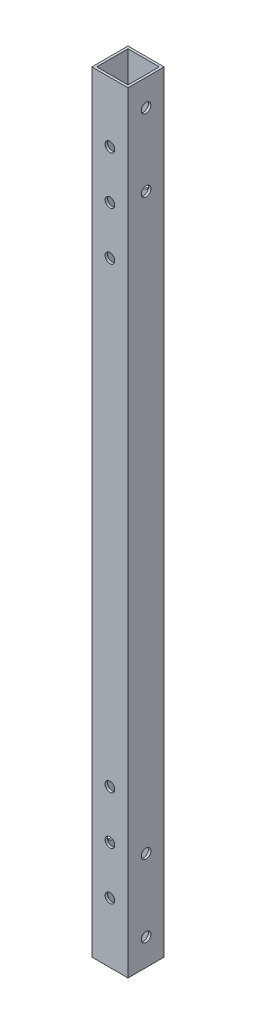
ISO-10303-21;
HEADER;
FILE_DESCRIPTION(('STEP AP214'),'2;1');
FILE_NAME('part.step','',(''),(''),'','','');
FILE_SCHEMA(('AUTOMOTIVE_DESIGN { 1 0 10303 214 1 1 1 1 }'));
ENDSEC;
DATA;
#1=APPLICATION_CONTEXT('core data for automotive mechanical design processes');
#2=APPLICATION_PROTOCOL_DEFINITION('international standard','automotive_design',2000,#1);
#3=PRODUCT_CONTEXT('',#1,'mechanical');
#4=PRODUCT('Part','Part','',(#3));
#5=PRODUCT_RELATED_PRODUCT_CATEGORY('part','',(#4));
#6=PRODUCT_DEFINITION_FORMATION('','',#4);
#7=PRODUCT_DEFINITION_CONTEXT('part definition',#1,'design');
#8=PRODUCT_DEFINITION('design','',#6,#7);
#9=PRODUCT_DEFINITION_SHAPE('','',#8);
#10=(LENGTH_UNIT() NAMED_UNIT(*) SI_UNIT(.MILLI.,.METRE.));
#11=(NAMED_UNIT(*) PLANE_ANGLE_UNIT() SI_UNIT($,.RADIAN.));
#12=(NAMED_UNIT(*) SI_UNIT($,.STERADIAN.) SOLID_ANGLE_UNIT());
#13=UNCERTAINTY_MEASURE_WITH_UNIT(LENGTH_MEASURE(1.E-05),#10,'distance_accuracy_value','');
#14=(GEOMETRIC_REPRESENTATION_CONTEXT(3) GLOBAL_UNCERTAINTY_ASSIGNED_CONTEXT((#13)) GLOBAL_UNIT_ASSIGNED_CONTEXT((#10,
#11,#12)) REPRESENTATION_CONTEXT('',''));
#15=CARTESIAN_POINT('',(0.,0.,0.));
#16=DIRECTION('',(0.,0.,1.));
#17=DIRECTION('',(1.,0.,0.));
#18=AXIS2_PLACEMENT_3D('',#15,#16,#17);
#19=CARTESIAN_POINT('',(0.,320.,0.));
#20=DIRECTION('',(0.,-1.,0.));
#21=DIRECTION('',(0.,0.,-1.));
#22=AXIS2_PLACEMENT_3D('',#19,#20,#21);
#23=PLANE('',#22);
#24=DIRECTION('',(0.,0.,-1.));
#25=VECTOR('',#24,1.);
#26=CARTESIAN_POINT('',(7.5,320.,7.5));
#27=LINE('',#26,#25);
#28=CARTESIAN_POINT('',(7.5,320.,7.5));
#29=VERTEX_POINT('',#28);
#30=CARTESIAN_POINT('',(7.5,320.,-7.5));
#31=VERTEX_POINT('',#30);
#32=EDGE_CURVE('E152',#29,#31,#27,.T.);
#33=ORIENTED_EDGE('',*,*,#32,.T.);
#34=DIRECTION('',(-1.,0.,0.));
#35=VECTOR('',#34,1.);
#36=CARTESIAN_POINT('',(-7.5,320.,-7.5));
#37=LINE('',#36,#35);
#38=CARTESIAN_POINT('',(-7.5,320.,-7.5));
#39=VERTEX_POINT('',#38);
#40=EDGE_CURVE('E155',#31,#39,#37,.T.);
#41=ORIENTED_EDGE('',*,*,#40,.T.);
#42=DIRECTION('',(0.,0.,1.));
#43=VECTOR('',#42,1.);
#44=CARTESIAN_POINT('',(-7.5,320.,7.5));
#45=LINE('',#44,#43);
#46=CARTESIAN_POINT('',(-7.5,320.,7.5));
#47=VERTEX_POINT('',#46);
#48=EDGE_CURVE('E160',#39,#47,#45,.T.);
#49=ORIENTED_EDGE('',*,*,#48,.T.);
#50=DIRECTION('',(1.,0.,0.));
#51=VECTOR('',#50,1.);
#52=CARTESIAN_POINT('',(-7.5,320.,7.5));
#53=LINE('',#52,#51);
#54=EDGE_CURVE('E339',#47,#29,#53,.T.);
#55=ORIENTED_EDGE('',*,*,#54,.T.);
#56=EDGE_LOOP('',(#33,#41,#49,#55));
#57=FACE_BOUND('',#56,.T.);
#58=DIRECTION('',(0.,0.,-1.));
#59=VECTOR('',#58,1.);
#60=CARTESIAN_POINT('',(6.5,320.,6.5));
#61=LINE('',#60,#59);
#62=CARTESIAN_POINT('',(6.5,320.,6.5));
#63=VERTEX_POINT('',#62);
#64=CARTESIAN_POINT('',(6.5,320.,-6.5));
#65=VERTEX_POINT('',#64);
#66=EDGE_CURVE('E114',#63,#65,#61,.T.);
#67=ORIENTED_EDGE('',*,*,#66,.F.);
#68=DIRECTION('',(1.,0.,0.));
#69=VECTOR('',#68,1.);
#70=CARTESIAN_POINT('',(-6.5,320.,6.5));
#71=LINE('',#70,#69);
#72=CARTESIAN_POINT('',(-6.5,320.,6.5));
#73=VERTEX_POINT('',#72);
#74=EDGE_CURVE('E136',#73,#63,#71,.T.);
#75=ORIENTED_EDGE('',*,*,#74,.F.);
#76=DIRECTION('',(0.,0.,1.));
#77=VECTOR('',#76,1.);
#78=CARTESIAN_POINT('',(-6.5,320.,6.5));
#79=LINE('',#78,#77);
#80=CARTESIAN_POINT('',(-6.5,320.,-6.5));
#81=VERTEX_POINT('',#80);
#82=EDGE_CURVE('E134',#81,#73,#79,.T.);
#83=ORIENTED_EDGE('',*,*,#82,.F.);
#84=DIRECTION('',(-1.,0.,0.));
#85=VECTOR('',#84,1.);
#86=CARTESIAN_POINT('',(-6.5,320.,-6.5));
#87=LINE('',#86,#85);
#88=EDGE_CURVE('E122',#65,#81,#87,.T.);
#89=ORIENTED_EDGE('',*,*,#88,.F.);
#90=EDGE_LOOP('',(#67,#75,#83,#89));
#91=FACE_BOUND('',#90,.T.);
#92=ADVANCED_FACE('F47',(#57,#91),#23,.F.);
#93=CARTESIAN_POINT('',(0.,0.,0.));
#94=DIRECTION('',(0.,-1.,0.));
#95=DIRECTION('',(0.,0.,-1.));
#96=AXIS2_PLACEMENT_3D('',#93,#94,#95);
#97=PLANE('',#96);
#98=DIRECTION('',(0.,0.,-1.));
#99=VECTOR('',#98,1.);
#100=CARTESIAN_POINT('',(7.5,0.,7.5));
#101=LINE('',#100,#99);
#102=CARTESIAN_POINT('',(7.5,0.,7.5));
#103=VERTEX_POINT('',#102);
#104=CARTESIAN_POINT('',(7.5,0.,-7.5));
#105=VERTEX_POINT('',#104);
#106=EDGE_CURVE('E130',#103,#105,#101,.T.);
#107=ORIENTED_EDGE('',*,*,#106,.F.);
#108=DIRECTION('',(1.,0.,0.));
#109=VECTOR('',#108,1.);
#110=CARTESIAN_POINT('',(-7.5,0.,7.5));
#111=LINE('',#110,#109);
#112=CARTESIAN_POINT('',(-7.5,0.,7.5));
#113=VERTEX_POINT('',#112);
#114=EDGE_CURVE('E156',#113,#103,#111,.T.);
#115=ORIENTED_EDGE('',*,*,#114,.F.);
#116=DIRECTION('',(0.,0.,1.));
#117=VECTOR('',#116,1.);
#118=CARTESIAN_POINT('',(-7.5,0.,7.5));
#119=LINE('',#118,#117);
#120=CARTESIAN_POINT('',(-7.5,0.,-7.5));
#121=VERTEX_POINT('',#120);
#122=EDGE_CURVE('E326',#121,#113,#119,.T.);
#123=ORIENTED_EDGE('',*,*,#122,.F.);
#124=DIRECTION('',(-1.,0.,0.));
#125=VECTOR('',#124,1.);
#126=CARTESIAN_POINT('',(-7.5,0.,-7.5));
#127=LINE('',#126,#125);
#128=EDGE_CURVE('E318',#105,#121,#127,.T.);
#129=ORIENTED_EDGE('',*,*,#128,.F.);
#130=EDGE_LOOP('',(#107,#115,#123,#129));
#131=FACE_BOUND('',#130,.T.);
#132=DIRECTION('',(1.,0.,0.));
#133=VECTOR('',#132,1.);
#134=CARTESIAN_POINT('',(-6.5,0.,6.5));
#135=LINE('',#134,#133);
#136=CARTESIAN_POINT('',(-6.5,0.,6.5));
#137=VERTEX_POINT('',#136);
#138=CARTESIAN_POINT('',(6.5,0.,6.5));
#139=VERTEX_POINT('',#138);
#140=EDGE_CURVE('E123',#137,#139,#135,.T.);
#141=ORIENTED_EDGE('',*,*,#140,.T.);
#142=DIRECTION('',(0.,0.,-1.));
#143=VECTOR('',#142,1.);
#144=CARTESIAN_POINT('',(6.5,0.,6.5));
#145=LINE('',#144,#143);
#146=CARTESIAN_POINT('',(6.5,0.,-6.5));
#147=VERTEX_POINT('',#146);
#148=EDGE_CURVE('E72',#139,#147,#145,.T.);
#149=ORIENTED_EDGE('',*,*,#148,.T.);
#150=DIRECTION('',(-1.,0.,0.));
#151=VECTOR('',#150,1.);
#152=CARTESIAN_POINT('',(-6.5,0.,-6.5));
#153=LINE('',#152,#151);
#154=CARTESIAN_POINT('',(-6.5,0.,-6.5));
#155=VERTEX_POINT('',#154);
#156=EDGE_CURVE('E129',#147,#155,#153,.T.);
#157=ORIENTED_EDGE('',*,*,#156,.T.);
#158=DIRECTION('',(0.,0.,1.));
#159=VECTOR('',#158,1.);
#160=CARTESIAN_POINT('',(-6.5,0.,6.5));
#161=LINE('',#160,#159);
#162=EDGE_CURVE('E144',#155,#137,#161,.T.);
#163=ORIENTED_EDGE('',*,*,#162,.T.);
#164=EDGE_LOOP('',(#141,#149,#157,#163));
#165=FACE_BOUND('',#164,.T.);
#166=ADVANCED_FACE('F331',(#131,#165),#97,.T.);
#167=CARTESIAN_POINT('',(7.5,320.,7.5));
#168=DIRECTION('',(-1.,0.,0.));
#169=DIRECTION('',(0.,0.,1.));
#170=AXIS2_PLACEMENT_3D('',#167,#168,#169);
#171=PLANE('',#170);
#172=CARTESIAN_POINT('',(7.5,11.,0.));
#173=DIRECTION('',(-1.,0.,0.));
#174=DIRECTION('',(0.,0.,1.));
#175=AXIS2_PLACEMENT_3D('',#172,#173,#174);
#176=CIRCLE('',#175,2.);
#177=CARTESIAN_POINT('',(7.5,11.,2.));
#178=VERTEX_POINT('',#177);
#179=EDGE_CURVE('E203',#178,#178,#176,.T.);
#180=ORIENTED_EDGE('',*,*,#179,.T.);
#181=EDGE_LOOP('',(#180));
#182=FACE_BOUND('',#181,.T.);
#183=CARTESIAN_POINT('',(7.5,41.,0.));
#184=DIRECTION('',(-1.,0.,0.));
#185=DIRECTION('',(0.,0.,1.));
#186=AXIS2_PLACEMENT_3D('',#183,#184,#185);
#187=CIRCLE('',#186,2.);
#188=CARTESIAN_POINT('',(7.5,41.,2.));
#189=VERTEX_POINT('',#188);
#190=EDGE_CURVE('E436',#189,#189,#187,.T.);
#191=ORIENTED_EDGE('',*,*,#190,.T.);
#192=EDGE_LOOP('',(#191));
#193=FACE_BOUND('',#192,.T.);
#194=CARTESIAN_POINT('',(7.5,279.,0.));
#195=DIRECTION('',(-1.,0.,0.));
#196=DIRECTION('',(0.,0.,-1.));
#197=AXIS2_PLACEMENT_3D('',#194,#195,#196);
#198=CIRCLE('',#197,2.00000000000001);
#199=CARTESIAN_POINT('',(7.5,279.,-2.00000000000001));
#200=VERTEX_POINT('',#199);
#201=EDGE_CURVE('E444',#200,#200,#198,.T.);
#202=ORIENTED_EDGE('',*,*,#201,.T.);
#203=EDGE_LOOP('',(#202));
#204=FACE_BOUND('',#203,.T.);
#205=CARTESIAN_POINT('',(7.5,309.,0.));
#206=DIRECTION('',(-1.,0.,0.));
#207=DIRECTION('',(0.,0.,-1.));
#208=AXIS2_PLACEMENT_3D('',#205,#206,#207);
#209=CIRCLE('',#208,2.00000000000001);
#210=CARTESIAN_POINT('',(7.5,309.,-2.00000000000001));
#211=VERTEX_POINT('',#210);
#212=EDGE_CURVE('E450',#211,#211,#209,.T.);
#213=ORIENTED_EDGE('',*,*,#212,.T.);
#214=EDGE_LOOP('',(#213));
#215=FACE_BOUND('',#214,.T.);
#216=ORIENTED_EDGE('',*,*,#106,.T.);
#217=DIRECTION('',(0.,-1.,0.));
#218=VECTOR('',#217,1.);
#219=CARTESIAN_POINT('',(7.5,320.,-7.5));
#220=LINE('',#219,#218);
#221=EDGE_CURVE('E12',#31,#105,#220,.T.);
#222=ORIENTED_EDGE('',*,*,#221,.F.);
#223=ORIENTED_EDGE('',*,*,#32,.F.);
#224=DIRECTION('',(0.,-1.,0.));
#225=VECTOR('',#224,1.);
#226=CARTESIAN_POINT('',(7.5,320.,7.5));
#227=LINE('',#226,#225);
#228=EDGE_CURVE('E337',#29,#103,#227,.T.);
#229=ORIENTED_EDGE('',*,*,#228,.T.);
#230=EDGE_LOOP('',(#216,#222,#223,#229));
#231=FACE_BOUND('',#230,.T.);
#232=ADVANCED_FACE('F49',(#182,#193,#204,#215,#231),#171,.F.);
#233=CARTESIAN_POINT('',(-7.5,320.,-7.5));
#234=DIRECTION('',(0.,0.,1.));
#235=DIRECTION('',(1.,0.,0.));
#236=AXIS2_PLACEMENT_3D('',#233,#234,#235);
#237=PLANE('',#236);
#238=CARTESIAN_POINT('',(0.,295.,-7.5));
#239=DIRECTION('',(0.,0.,1.));
#240=DIRECTION('',(1.,0.,0.));
#241=AXIS2_PLACEMENT_3D('',#238,#239,#240);
#242=CIRCLE('',#241,2.00000000000001);
#243=CARTESIAN_POINT('',(1.99999999999997,295.,-7.5));
#244=VERTEX_POINT('',#243);
#245=EDGE_CURVE('E179',#244,#244,#242,.T.);
#246=ORIENTED_EDGE('',*,*,#245,.T.);
#247=EDGE_LOOP('',(#246));
#248=FACE_BOUND('',#247,.T.);
#249=CARTESIAN_POINT('',(0.,65.,-7.5));
#250=DIRECTION('',(0.,0.,1.));
#251=DIRECTION('',(-1.,0.,0.));
#252=AXIS2_PLACEMENT_3D('',#249,#250,#251);
#253=CIRCLE('',#252,2.);
#254=CARTESIAN_POINT('',(-2.,65.,-7.5));
#255=VERTEX_POINT('',#254);
#256=EDGE_CURVE('E236',#255,#255,#253,.T.);
#257=ORIENTED_EDGE('',*,*,#256,.T.);
#258=EDGE_LOOP('',(#257));
#259=FACE_BOUND('',#258,.T.);
#260=CARTESIAN_POINT('',(0.,275.,-7.5));
#261=DIRECTION('',(0.,0.,1.));
#262=DIRECTION('',(1.,0.,0.));
#263=AXIS2_PLACEMENT_3D('',#260,#261,#262);
#264=CIRCLE('',#263,2.00000000000001);
#265=CARTESIAN_POINT('',(1.99999999999998,275.,-7.5));
#266=VERTEX_POINT('',#265);
#267=EDGE_CURVE('E260',#266,#266,#264,.T.);
#268=ORIENTED_EDGE('',*,*,#267,.T.);
#269=EDGE_LOOP('',(#268));
#270=FACE_BOUND('',#269,.T.);
#271=CARTESIAN_POINT('',(0.,45.,-7.5));
#272=DIRECTION('',(0.,0.,1.));
#273=DIRECTION('',(-1.,0.,0.));
#274=AXIS2_PLACEMENT_3D('',#271,#272,#273);
#275=CIRCLE('',#274,2.);
#276=CARTESIAN_POINT('',(-2.,45.,-7.5));
#277=VERTEX_POINT('',#276);
#278=EDGE_CURVE('E267',#277,#277,#275,.T.);
#279=ORIENTED_EDGE('',*,*,#278,.T.);
#280=EDGE_LOOP('',(#279));
#281=FACE_BOUND('',#280,.T.);
#282=CARTESIAN_POINT('',(0.,25.,-7.5));
#283=DIRECTION('',(0.,0.,1.));
#284=DIRECTION('',(-1.,0.,0.));
#285=AXIS2_PLACEMENT_3D('',#282,#283,#284);
#286=CIRCLE('',#285,2.);
#287=CARTESIAN_POINT('',(-2.,25.,-7.5));
#288=VERTEX_POINT('',#287);
#289=EDGE_CURVE('E244',#288,#288,#286,.T.);
#290=ORIENTED_EDGE('',*,*,#289,.T.);
#291=EDGE_LOOP('',(#290));
#292=FACE_BOUND('',#291,.T.);
#293=CARTESIAN_POINT('',(0.,255.,-7.5));
#294=DIRECTION('',(0.,0.,1.));
#295=DIRECTION('',(1.,0.,0.));
#296=AXIS2_PLACEMENT_3D('',#293,#294,#295);
#297=CIRCLE('',#296,2.00000000000001);
#298=CARTESIAN_POINT('',(1.99999999999998,255.,-7.5));
#299=VERTEX_POINT('',#298);
#300=EDGE_CURVE('E254',#299,#299,#297,.T.);
#301=ORIENTED_EDGE('',*,*,#300,.T.);
#302=EDGE_LOOP('',(#301));
#303=FACE_BOUND('',#302,.T.);
#304=ORIENTED_EDGE('',*,*,#128,.T.);
#305=DIRECTION('',(0.,-1.,0.));
#306=VECTOR('',#305,1.);
#307=CARTESIAN_POINT('',(-7.5,320.,-7.5));
#308=LINE('',#307,#306);
#309=EDGE_CURVE('E57',#39,#121,#308,.T.);
#310=ORIENTED_EDGE('',*,*,#309,.F.);
#311=ORIENTED_EDGE('',*,*,#40,.F.);
#312=ORIENTED_EDGE('',*,*,#221,.T.);
#313=EDGE_LOOP('',(#304,#310,#311,#312));
#314=FACE_BOUND('',#313,.T.);
#315=ADVANCED_FACE('F312',(#248,#259,#270,#281,#292,#303,#314),#237,.F.);
#316=CARTESIAN_POINT('',(-7.5,320.,7.5));
#317=DIRECTION('',(1.,0.,0.));
#318=DIRECTION('',(0.,0.,-1.));
#319=AXIS2_PLACEMENT_3D('',#316,#317,#318);
#320=PLANE('',#319);
#321=CARTESIAN_POINT('',(-7.5,11.,0.));
#322=DIRECTION('',(-1.,0.,0.));
#323=DIRECTION('',(0.,0.,1.));
#324=AXIS2_PLACEMENT_3D('',#321,#322,#323);
#325=CIRCLE('',#324,2.);
#326=CARTESIAN_POINT('',(-7.5,11.,2.));
#327=VERTEX_POINT('',#326);
#328=EDGE_CURVE('E433',#327,#327,#325,.T.);
#329=ORIENTED_EDGE('',*,*,#328,.F.);
#330=EDGE_LOOP('',(#329));
#331=FACE_BOUND('',#330,.T.);
#332=CARTESIAN_POINT('',(-7.5,41.,0.));
#333=DIRECTION('',(-1.,0.,0.));
#334=DIRECTION('',(0.,0.,1.));
#335=AXIS2_PLACEMENT_3D('',#332,#333,#334);
#336=CIRCLE('',#335,2.);
#337=CARTESIAN_POINT('',(-7.5,41.,2.));
#338=VERTEX_POINT('',#337);
#339=EDGE_CURVE('E441',#338,#338,#336,.T.);
#340=ORIENTED_EDGE('',*,*,#339,.F.);
#341=EDGE_LOOP('',(#340));
#342=FACE_BOUND('',#341,.T.);
#343=CARTESIAN_POINT('',(-7.5,279.,0.));
#344=DIRECTION('',(-1.,0.,0.));
#345=DIRECTION('',(0.,0.,-1.));
#346=AXIS2_PLACEMENT_3D('',#343,#344,#345);
#347=CIRCLE('',#346,2.00000000000001);
#348=CARTESIAN_POINT('',(-7.5,279.,-2.00000000000001));
#349=VERTEX_POINT('',#348);
#350=EDGE_CURVE('E447',#349,#349,#347,.T.);
#351=ORIENTED_EDGE('',*,*,#350,.F.);
#352=EDGE_LOOP('',(#351));
#353=FACE_BOUND('',#352,.T.);
#354=CARTESIAN_POINT('',(-7.5,309.,0.));
#355=DIRECTION('',(-1.,0.,0.));
#356=DIRECTION('',(0.,0.,-1.));
#357=AXIS2_PLACEMENT_3D('',#354,#355,#356);
#358=CIRCLE('',#357,2.00000000000001);
#359=CARTESIAN_POINT('',(-7.5,309.,-2.00000000000001));
#360=VERTEX_POINT('',#359);
#361=EDGE_CURVE('E452',#360,#360,#358,.T.);
#362=ORIENTED_EDGE('',*,*,#361,.F.);
#363=EDGE_LOOP('',(#362));
#364=FACE_BOUND('',#363,.T.);
#365=ORIENTED_EDGE('',*,*,#122,.T.);
#366=DIRECTION('',(0.,-1.,0.));
#367=VECTOR('',#366,1.);
#368=CARTESIAN_POINT('',(-7.5,320.,7.5));
#369=LINE('',#368,#367);
#370=EDGE_CURVE('E171',#47,#113,#369,.T.);
#371=ORIENTED_EDGE('',*,*,#370,.F.);
#372=ORIENTED_EDGE('',*,*,#48,.F.);
#373=ORIENTED_EDGE('',*,*,#309,.T.);
#374=EDGE_LOOP('',(#365,#371,#372,#373));
#375=FACE_BOUND('',#374,.T.);
#376=ADVANCED_FACE('F315',(#331,#342,#353,#364,#375),#320,.F.);
#377=CARTESIAN_POINT('',(-7.5,320.,7.5));
#378=DIRECTION('',(0.,0.,-1.));
#379=DIRECTION('',(-1.,0.,0.));
#380=AXIS2_PLACEMENT_3D('',#377,#378,#379);
#381=PLANE('',#380);
#382=CARTESIAN_POINT('',(0.,295.,7.5));
#383=DIRECTION('',(0.,0.,1.));
#384=DIRECTION('',(1.,0.,0.));
#385=AXIS2_PLACEMENT_3D('',#382,#383,#384);
#386=CIRCLE('',#385,2.00000000000001);
#387=CARTESIAN_POINT('',(1.99999999999997,295.,7.5));
#388=VERTEX_POINT('',#387);
#389=EDGE_CURVE('E229',#388,#388,#386,.T.);
#390=ORIENTED_EDGE('',*,*,#389,.F.);
#391=EDGE_LOOP('',(#390));
#392=FACE_BOUND('',#391,.T.);
#393=CARTESIAN_POINT('',(0.,65.,7.5));
#394=DIRECTION('',(0.,0.,1.));
#395=DIRECTION('',(-1.,0.,0.));
#396=AXIS2_PLACEMENT_3D('',#393,#394,#395);
#397=CIRCLE('',#396,2.);
#398=CARTESIAN_POINT('',(-2.,65.,7.5));
#399=VERTEX_POINT('',#398);
#400=EDGE_CURVE('E224',#399,#399,#397,.T.);
#401=ORIENTED_EDGE('',*,*,#400,.F.);
#402=EDGE_LOOP('',(#401));
#403=FACE_BOUND('',#402,.T.);
#404=CARTESIAN_POINT('',(0.,275.,7.5));
#405=DIRECTION('',(0.,0.,1.));
#406=DIRECTION('',(1.,0.,0.));
#407=AXIS2_PLACEMENT_3D('',#404,#405,#406);
#408=CIRCLE('',#407,2.00000000000001);
#409=CARTESIAN_POINT('',(1.99999999999998,275.,7.5));
#410=VERTEX_POINT('',#409);
#411=EDGE_CURVE('E265',#410,#410,#408,.T.);
#412=ORIENTED_EDGE('',*,*,#411,.F.);
#413=EDGE_LOOP('',(#412));
#414=FACE_BOUND('',#413,.T.);
#415=CARTESIAN_POINT('',(0.,45.,7.5));
#416=DIRECTION('',(0.,0.,1.));
#417=DIRECTION('',(-1.,0.,0.));
#418=AXIS2_PLACEMENT_3D('',#415,#416,#417);
#419=CIRCLE('',#418,2.);
#420=CARTESIAN_POINT('',(-2.,45.,7.5));
#421=VERTEX_POINT('',#420);
#422=EDGE_CURVE('E249',#421,#421,#419,.T.);
#423=ORIENTED_EDGE('',*,*,#422,.F.);
#424=EDGE_LOOP('',(#423));
#425=FACE_BOUND('',#424,.T.);
#426=CARTESIAN_POINT('',(0.,25.,7.5));
#427=DIRECTION('',(0.,0.,1.));
#428=DIRECTION('',(-1.,0.,0.));
#429=AXIS2_PLACEMENT_3D('',#426,#427,#428);
#430=CIRCLE('',#429,2.);
#431=CARTESIAN_POINT('',(-2.,25.,7.5));
#432=VERTEX_POINT('',#431);
#433=EDGE_CURVE('E250',#432,#432,#430,.T.);
#434=ORIENTED_EDGE('',*,*,#433,.F.);
#435=EDGE_LOOP('',(#434));
#436=FACE_BOUND('',#435,.T.);
#437=CARTESIAN_POINT('',(0.,255.,7.5));
#438=DIRECTION('',(0.,0.,1.));
#439=DIRECTION('',(1.,0.,0.));
#440=AXIS2_PLACEMENT_3D('',#437,#438,#439);
#441=CIRCLE('',#440,2.00000000000001);
#442=CARTESIAN_POINT('',(1.99999999999998,255.,7.5));
#443=VERTEX_POINT('',#442);
#444=EDGE_CURVE('E241',#443,#443,#441,.T.);
#445=ORIENTED_EDGE('',*,*,#444,.F.);
#446=EDGE_LOOP('',(#445));
#447=FACE_BOUND('',#446,.T.);
#448=ORIENTED_EDGE('',*,*,#114,.T.);
#449=ORIENTED_EDGE('',*,*,#228,.F.);
#450=ORIENTED_EDGE('',*,*,#54,.F.);
#451=ORIENTED_EDGE('',*,*,#370,.T.);
#452=EDGE_LOOP('',(#448,#449,#450,#451));
#453=FACE_BOUND('',#452,.T.);
#454=ADVANCED_FACE('F346',(#392,#403,#414,#425,#436,#447,#453),#381,.F.);
#455=CARTESIAN_POINT('',(6.5,320.,6.5));
#456=DIRECTION('',(-1.,0.,0.));
#457=DIRECTION('',(0.,0.,1.));
#458=AXIS2_PLACEMENT_3D('',#455,#456,#457);
#459=PLANE('',#458);
#460=CARTESIAN_POINT('',(6.5,11.,0.));
#461=DIRECTION('',(-1.,0.,0.));
#462=DIRECTION('',(0.,0.,1.));
#463=AXIS2_PLACEMENT_3D('',#460,#461,#462);
#464=CIRCLE('',#463,2.);
#465=CARTESIAN_POINT('',(6.5,11.,2.));
#466=VERTEX_POINT('',#465);
#467=EDGE_CURVE('E221',#466,#466,#464,.T.);
#468=ORIENTED_EDGE('',*,*,#467,.F.);
#469=EDGE_LOOP('',(#468));
#470=FACE_BOUND('',#469,.T.);
#471=CARTESIAN_POINT('',(6.5,41.,0.));
#472=DIRECTION('',(-1.,0.,0.));
#473=DIRECTION('',(0.,0.,1.));
#474=AXIS2_PLACEMENT_3D('',#471,#472,#473);
#475=CIRCLE('',#474,2.);
#476=CARTESIAN_POINT('',(6.5,41.,2.));
#477=VERTEX_POINT('',#476);
#478=EDGE_CURVE('E209',#477,#477,#475,.T.);
#479=ORIENTED_EDGE('',*,*,#478,.F.);
#480=EDGE_LOOP('',(#479));
#481=FACE_BOUND('',#480,.T.);
#482=CARTESIAN_POINT('',(6.5,279.,0.));
#483=DIRECTION('',(-1.,0.,0.));
#484=DIRECTION('',(0.,0.,1.));
#485=AXIS2_PLACEMENT_3D('',#482,#483,#484);
#486=CIRCLE('',#485,2.00000000000001);
#487=CARTESIAN_POINT('',(6.5,279.,2.00000000000001));
#488=VERTEX_POINT('',#487);
#489=EDGE_CURVE('E206',#488,#488,#486,.T.);
#490=ORIENTED_EDGE('',*,*,#489,.F.);
#491=EDGE_LOOP('',(#490));
#492=FACE_BOUND('',#491,.T.);
#493=CARTESIAN_POINT('',(6.5,309.,0.));
#494=DIRECTION('',(-1.,0.,0.));
#495=DIRECTION('',(0.,0.,1.));
#496=AXIS2_PLACEMENT_3D('',#493,#494,#495);
#497=CIRCLE('',#496,2.00000000000001);
#498=CARTESIAN_POINT('',(6.5,309.,2.00000000000001));
#499=VERTEX_POINT('',#498);
#500=EDGE_CURVE('E202',#499,#499,#497,.T.);
#501=ORIENTED_EDGE('',*,*,#500,.F.);
#502=EDGE_LOOP('',(#501));
#503=FACE_BOUND('',#502,.T.);
#504=ORIENTED_EDGE('',*,*,#148,.F.);
#505=DIRECTION('',(0.,-1.,0.));
#506=VECTOR('',#505,1.);
#507=CARTESIAN_POINT('',(6.5,320.,6.5));
#508=LINE('',#507,#506);
#509=EDGE_CURVE('E118',#63,#139,#508,.T.);
#510=ORIENTED_EDGE('',*,*,#509,.F.);
#511=ORIENTED_EDGE('',*,*,#66,.T.);
#512=DIRECTION('',(0.,-1.,0.));
#513=VECTOR('',#512,1.);
#514=CARTESIAN_POINT('',(6.5,320.,-6.5));
#515=LINE('',#514,#513);
#516=EDGE_CURVE('E117',#65,#147,#515,.T.);
#517=ORIENTED_EDGE('',*,*,#516,.T.);
#518=EDGE_LOOP('',(#504,#510,#511,#517));
#519=FACE_BOUND('',#518,.T.);
#520=ADVANCED_FACE('F116',(#470,#481,#492,#503,#519),#459,.T.);
#521=CARTESIAN_POINT('',(-6.5,320.,-6.5));
#522=DIRECTION('',(0.,0.,1.));
#523=DIRECTION('',(1.,0.,0.));
#524=AXIS2_PLACEMENT_3D('',#521,#522,#523);
#525=PLANE('',#524);
#526=CARTESIAN_POINT('',(0.,295.,-6.5));
#527=DIRECTION('',(0.,0.,1.));
#528=DIRECTION('',(1.,0.,0.));
#529=AXIS2_PLACEMENT_3D('',#526,#527,#528);
#530=CIRCLE('',#529,2.00000000000001);
#531=CARTESIAN_POINT('',(1.99999999999997,295.,-6.5));
#532=VERTEX_POINT('',#531);
#533=EDGE_CURVE('E142',#532,#532,#530,.T.);
#534=ORIENTED_EDGE('',*,*,#533,.F.);
#535=EDGE_LOOP('',(#534));
#536=FACE_BOUND('',#535,.T.);
#537=CARTESIAN_POINT('',(0.,65.,-6.5));
#538=DIRECTION('',(0.,0.,1.));
#539=DIRECTION('',(1.,0.,0.));
#540=AXIS2_PLACEMENT_3D('',#537,#538,#539);
#541=CIRCLE('',#540,2.);
#542=CARTESIAN_POINT('',(2.,65.,-6.5));
#543=VERTEX_POINT('',#542);
#544=EDGE_CURVE('E195',#543,#543,#541,.T.);
#545=ORIENTED_EDGE('',*,*,#544,.F.);
#546=EDGE_LOOP('',(#545));
#547=FACE_BOUND('',#546,.T.);
#548=CARTESIAN_POINT('',(0.,275.,-6.5));
#549=DIRECTION('',(0.,0.,1.));
#550=DIRECTION('',(1.,0.,0.));
#551=AXIS2_PLACEMENT_3D('',#548,#549,#550);
#552=CIRCLE('',#551,2.00000000000001);
#553=CARTESIAN_POINT('',(1.99999999999998,275.,-6.5));
#554=VERTEX_POINT('',#553);
#555=EDGE_CURVE('E191',#554,#554,#552,.T.);
#556=ORIENTED_EDGE('',*,*,#555,.F.);
#557=EDGE_LOOP('',(#556));
#558=FACE_BOUND('',#557,.T.);
#559=CARTESIAN_POINT('',(0.,45.,-6.5));
#560=DIRECTION('',(0.,0.,1.));
#561=DIRECTION('',(1.,0.,0.));
#562=AXIS2_PLACEMENT_3D('',#559,#560,#561);
#563=CIRCLE('',#562,2.);
#564=CARTESIAN_POINT('',(2.,45.,-6.5));
#565=VERTEX_POINT('',#564);
#566=EDGE_CURVE('E187',#565,#565,#563,.T.);
#567=ORIENTED_EDGE('',*,*,#566,.F.);
#568=EDGE_LOOP('',(#567));
#569=FACE_BOUND('',#568,.T.);
#570=CARTESIAN_POINT('',(0.,25.,-6.5));
#571=DIRECTION('',(0.,0.,1.));
#572=DIRECTION('',(1.,0.,0.));
#573=AXIS2_PLACEMENT_3D('',#570,#571,#572);
#574=CIRCLE('',#573,2.);
#575=CARTESIAN_POINT('',(2.,25.,-6.5));
#576=VERTEX_POINT('',#575);
#577=EDGE_CURVE('E183',#576,#576,#574,.T.);
#578=ORIENTED_EDGE('',*,*,#577,.F.);
#579=EDGE_LOOP('',(#578));
#580=FACE_BOUND('',#579,.T.);
#581=CARTESIAN_POINT('',(0.,255.,-6.5));
#582=DIRECTION('',(0.,0.,1.));
#583=DIRECTION('',(1.,0.,0.));
#584=AXIS2_PLACEMENT_3D('',#581,#582,#583);
#585=CIRCLE('',#584,2.00000000000001);
#586=CARTESIAN_POINT('',(1.99999999999998,255.,-6.5));
#587=VERTEX_POINT('',#586);
#588=EDGE_CURVE('E178',#587,#587,#585,.T.);
#589=ORIENTED_EDGE('',*,*,#588,.F.);
#590=EDGE_LOOP('',(#589));
#591=FACE_BOUND('',#590,.T.);
#592=ORIENTED_EDGE('',*,*,#156,.F.);
#593=ORIENTED_EDGE('',*,*,#516,.F.);
#594=ORIENTED_EDGE('',*,*,#88,.T.);
#595=DIRECTION('',(0.,-1.,0.));
#596=VECTOR('',#595,1.);
#597=CARTESIAN_POINT('',(-6.5,320.,-6.5));
#598=LINE('',#597,#596);
#599=EDGE_CURVE('E131',#81,#155,#598,.T.);
#600=ORIENTED_EDGE('',*,*,#599,.T.);
#601=EDGE_LOOP('',(#592,#593,#594,#600));
#602=FACE_BOUND('',#601,.T.);
#603=ADVANCED_FACE('F126',(#536,#547,#558,#569,#580,#591,#602),#525,.T.);
#604=CARTESIAN_POINT('',(-6.5,320.,6.5));
#605=DIRECTION('',(1.,0.,0.));
#606=DIRECTION('',(0.,0.,-1.));
#607=AXIS2_PLACEMENT_3D('',#604,#605,#606);
#608=PLANE('',#607);
#609=CARTESIAN_POINT('',(-6.5,11.,0.));
#610=DIRECTION('',(1.,0.,0.));
#611=DIRECTION('',(0.,0.,-1.));
#612=AXIS2_PLACEMENT_3D('',#609,#610,#611);
#613=CIRCLE('',#612,2.);
#614=CARTESIAN_POINT('',(-6.5,11.,-2.));
#615=VERTEX_POINT('',#614);
#616=EDGE_CURVE('E51',#615,#615,#613,.T.);
#617=ORIENTED_EDGE('',*,*,#616,.F.);
#618=EDGE_LOOP('',(#617));
#619=FACE_BOUND('',#618,.T.);
#620=CARTESIAN_POINT('',(-6.5,41.,0.));
#621=DIRECTION('',(1.,0.,0.));
#622=DIRECTION('',(0.,0.,-1.));
#623=AXIS2_PLACEMENT_3D('',#620,#621,#622);
#624=CIRCLE('',#623,2.);
#625=CARTESIAN_POINT('',(-6.5,41.,-2.));
#626=VERTEX_POINT('',#625);
#627=EDGE_CURVE('E207',#626,#626,#624,.T.);
#628=ORIENTED_EDGE('',*,*,#627,.F.);
#629=EDGE_LOOP('',(#628));
#630=FACE_BOUND('',#629,.T.);
#631=CARTESIAN_POINT('',(-6.5,279.,0.));
#632=DIRECTION('',(1.,0.,0.));
#633=DIRECTION('',(0.,0.,-1.));
#634=AXIS2_PLACEMENT_3D('',#631,#632,#633);
#635=CIRCLE('',#634,2.00000000000001);
#636=CARTESIAN_POINT('',(-6.5,279.,-2.00000000000001));
#637=VERTEX_POINT('',#636);
#638=EDGE_CURVE('E204',#637,#637,#635,.T.);
#639=ORIENTED_EDGE('',*,*,#638,.F.);
#640=EDGE_LOOP('',(#639));
#641=FACE_BOUND('',#640,.T.);
#642=CARTESIAN_POINT('',(-6.5,309.,0.));
#643=DIRECTION('',(1.,0.,0.));
#644=DIRECTION('',(0.,0.,-1.));
#645=AXIS2_PLACEMENT_3D('',#642,#643,#644);
#646=CIRCLE('',#645,2.00000000000001);
#647=CARTESIAN_POINT('',(-6.5,309.,-2.00000000000001));
#648=VERTEX_POINT('',#647);
#649=EDGE_CURVE('E199',#648,#648,#646,.T.);
#650=ORIENTED_EDGE('',*,*,#649,.F.);
#651=EDGE_LOOP('',(#650));
#652=FACE_BOUND('',#651,.T.);
#653=ORIENTED_EDGE('',*,*,#162,.F.);
#654=ORIENTED_EDGE('',*,*,#599,.F.);
#655=ORIENTED_EDGE('',*,*,#82,.T.);
#656=DIRECTION('',(0.,-1.,0.));
#657=VECTOR('',#656,1.);
#658=CARTESIAN_POINT('',(-6.5,320.,6.5));
#659=LINE('',#658,#657);
#660=EDGE_CURVE('E64',#73,#137,#659,.T.);
#661=ORIENTED_EDGE('',*,*,#660,.T.);
#662=EDGE_LOOP('',(#653,#654,#655,#661));
#663=FACE_BOUND('',#662,.T.);
#664=ADVANCED_FACE('F291',(#619,#630,#641,#652,#663),#608,.T.);
#665=CARTESIAN_POINT('',(-6.5,320.,6.5));
#666=DIRECTION('',(0.,0.,-1.));
#667=DIRECTION('',(-1.,0.,0.));
#668=AXIS2_PLACEMENT_3D('',#665,#666,#667);
#669=PLANE('',#668);
#670=CARTESIAN_POINT('',(0.,295.,6.5));
#671=DIRECTION('',(0.,0.,-1.));
#672=DIRECTION('',(-1.,0.,0.));
#673=AXIS2_PLACEMENT_3D('',#670,#671,#672);
#674=CIRCLE('',#673,2.00000000000001);
#675=CARTESIAN_POINT('',(-2.00000000000004,295.,6.5));
#676=VERTEX_POINT('',#675);
#677=EDGE_CURVE('E196',#676,#676,#674,.T.);
#678=ORIENTED_EDGE('',*,*,#677,.F.);
#679=EDGE_LOOP('',(#678));
#680=FACE_BOUND('',#679,.T.);
#681=CARTESIAN_POINT('',(0.,65.,6.5));
#682=DIRECTION('',(0.,0.,-1.));
#683=DIRECTION('',(-1.,0.,0.));
#684=AXIS2_PLACEMENT_3D('',#681,#682,#683);
#685=CIRCLE('',#684,2.);
#686=CARTESIAN_POINT('',(-2.,65.,6.5));
#687=VERTEX_POINT('',#686);
#688=EDGE_CURVE('E192',#687,#687,#685,.T.);
#689=ORIENTED_EDGE('',*,*,#688,.F.);
#690=EDGE_LOOP('',(#689));
#691=FACE_BOUND('',#690,.T.);
#692=CARTESIAN_POINT('',(0.,275.,6.5));
#693=DIRECTION('',(0.,0.,-1.));
#694=DIRECTION('',(-1.,0.,0.));
#695=AXIS2_PLACEMENT_3D('',#692,#693,#694);
#696=CIRCLE('',#695,2.00000000000001);
#697=CARTESIAN_POINT('',(-2.00000000000003,275.,6.5));
#698=VERTEX_POINT('',#697);
#699=EDGE_CURVE('E188',#698,#698,#696,.T.);
#700=ORIENTED_EDGE('',*,*,#699,.F.);
#701=EDGE_LOOP('',(#700));
#702=FACE_BOUND('',#701,.T.);
#703=CARTESIAN_POINT('',(0.,45.,6.5));
#704=DIRECTION('',(0.,0.,-1.));
#705=DIRECTION('',(-1.,0.,0.));
#706=AXIS2_PLACEMENT_3D('',#703,#704,#705);
#707=CIRCLE('',#706,2.);
#708=CARTESIAN_POINT('',(-2.,45.,6.5));
#709=VERTEX_POINT('',#708);
#710=EDGE_CURVE('E184',#709,#709,#707,.T.);
#711=ORIENTED_EDGE('',*,*,#710,.F.);
#712=EDGE_LOOP('',(#711));
#713=FACE_BOUND('',#712,.T.);
#714=CARTESIAN_POINT('',(0.,25.,6.5));
#715=DIRECTION('',(0.,0.,-1.));
#716=DIRECTION('',(-1.,0.,0.));
#717=AXIS2_PLACEMENT_3D('',#714,#715,#716);
#718=CIRCLE('',#717,2.);
#719=CARTESIAN_POINT('',(-2.,25.,6.5));
#720=VERTEX_POINT('',#719);
#721=EDGE_CURVE('E180',#720,#720,#718,.T.);
#722=ORIENTED_EDGE('',*,*,#721,.F.);
#723=EDGE_LOOP('',(#722));
#724=FACE_BOUND('',#723,.T.);
#725=CARTESIAN_POINT('',(0.,255.,6.5));
#726=DIRECTION('',(0.,0.,-1.));
#727=DIRECTION('',(-1.,0.,0.));
#728=AXIS2_PLACEMENT_3D('',#725,#726,#727);
#729=CIRCLE('',#728,2.00000000000001);
#730=CARTESIAN_POINT('',(-2.00000000000003,255.,6.5));
#731=VERTEX_POINT('',#730);
#732=EDGE_CURVE('E175',#731,#731,#729,.T.);
#733=ORIENTED_EDGE('',*,*,#732,.F.);
#734=EDGE_LOOP('',(#733));
#735=FACE_BOUND('',#734,.T.);
#736=ORIENTED_EDGE('',*,*,#140,.F.);
#737=ORIENTED_EDGE('',*,*,#660,.F.);
#738=ORIENTED_EDGE('',*,*,#74,.T.);
#739=ORIENTED_EDGE('',*,*,#509,.T.);
#740=EDGE_LOOP('',(#736,#737,#738,#739));
#741=FACE_BOUND('',#740,.T.);
#742=ADVANCED_FACE('F369',(#680,#691,#702,#713,#724,#735,#741),#669,.T.);
#743=CARTESIAN_POINT('',(0.,255.,-7.5));
#744=DIRECTION('',(0.,0.,1.));
#745=DIRECTION('',(1.,0.,0.));
#746=AXIS2_PLACEMENT_3D('',#743,#744,#745);
#747=CYLINDRICAL_SURFACE('',#746,2.00000000000001);
#748=ORIENTED_EDGE('',*,*,#732,.T.);
#749=EDGE_LOOP('',(#748));
#750=FACE_BOUND('',#749,.T.);
#751=ORIENTED_EDGE('',*,*,#444,.T.);
#752=EDGE_LOOP('',(#751));
#753=FACE_BOUND('',#752,.T.);
#754=ADVANCED_FACE('F309',(#750,#753),#747,.F.);
#755=CARTESIAN_POINT('',(0.,25.,-7.5));
#756=DIRECTION('',(0.,0.,1.));
#757=DIRECTION('',(1.,0.,0.));
#758=AXIS2_PLACEMENT_3D('',#755,#756,#757);
#759=CYLINDRICAL_SURFACE('',#758,2.);
#760=ORIENTED_EDGE('',*,*,#721,.T.);
#761=EDGE_LOOP('',(#760));
#762=FACE_BOUND('',#761,.T.);
#763=ORIENTED_EDGE('',*,*,#433,.T.);
#764=EDGE_LOOP('',(#763));
#765=FACE_BOUND('',#764,.T.);
#766=ADVANCED_FACE('F378',(#762,#765),#759,.F.);
#767=CARTESIAN_POINT('',(0.,45.,-7.5));
#768=DIRECTION('',(0.,0.,1.));
#769=DIRECTION('',(1.,0.,0.));
#770=AXIS2_PLACEMENT_3D('',#767,#768,#769);
#771=CYLINDRICAL_SURFACE('',#770,2.);
#772=ORIENTED_EDGE('',*,*,#710,.T.);
#773=EDGE_LOOP('',(#772));
#774=FACE_BOUND('',#773,.T.);
#775=ORIENTED_EDGE('',*,*,#422,.T.);
#776=EDGE_LOOP('',(#775));
#777=FACE_BOUND('',#776,.T.);
#778=ADVANCED_FACE('F374',(#774,#777),#771,.F.);
#779=CARTESIAN_POINT('',(0.,275.,-7.5));
#780=DIRECTION('',(0.,0.,1.));
#781=DIRECTION('',(1.,0.,0.));
#782=AXIS2_PLACEMENT_3D('',#779,#780,#781);
#783=CYLINDRICAL_SURFACE('',#782,2.00000000000001);
#784=ORIENTED_EDGE('',*,*,#699,.T.);
#785=EDGE_LOOP('',(#784));
#786=FACE_BOUND('',#785,.T.);
#787=ORIENTED_EDGE('',*,*,#411,.T.);
#788=EDGE_LOOP('',(#787));
#789=FACE_BOUND('',#788,.T.);
#790=ADVANCED_FACE('F377',(#786,#789),#783,.F.);
#791=CARTESIAN_POINT('',(0.,65.,-7.5));
#792=DIRECTION('',(0.,0.,1.));
#793=DIRECTION('',(1.,0.,0.));
#794=AXIS2_PLACEMENT_3D('',#791,#792,#793);
#795=CYLINDRICAL_SURFACE('',#794,2.);
#796=ORIENTED_EDGE('',*,*,#688,.T.);
#797=EDGE_LOOP('',(#796));
#798=FACE_BOUND('',#797,.T.);
#799=ORIENTED_EDGE('',*,*,#400,.T.);
#800=EDGE_LOOP('',(#799));
#801=FACE_BOUND('',#800,.T.);
#802=ADVANCED_FACE('F382',(#798,#801),#795,.F.);
#803=CARTESIAN_POINT('',(0.,295.,-7.5));
#804=DIRECTION('',(0.,0.,1.));
#805=DIRECTION('',(1.,0.,0.));
#806=AXIS2_PLACEMENT_3D('',#803,#804,#805);
#807=CYLINDRICAL_SURFACE('',#806,2.00000000000001);
#808=ORIENTED_EDGE('',*,*,#677,.T.);
#809=EDGE_LOOP('',(#808));
#810=FACE_BOUND('',#809,.T.);
#811=ORIENTED_EDGE('',*,*,#389,.T.);
#812=EDGE_LOOP('',(#811));
#813=FACE_BOUND('',#812,.T.);
#814=ADVANCED_FACE('F307',(#810,#813),#807,.F.);
#815=ORIENTED_EDGE('',*,*,#588,.T.);
#816=EDGE_LOOP('',(#815));
#817=FACE_BOUND('',#816,.T.);
#818=ORIENTED_EDGE('',*,*,#300,.F.);
#819=EDGE_LOOP('',(#818));
#820=FACE_BOUND('',#819,.T.);
#821=ADVANCED_FACE('F303',(#817,#820),#747,.F.);
#822=ORIENTED_EDGE('',*,*,#577,.T.);
#823=EDGE_LOOP('',(#822));
#824=FACE_BOUND('',#823,.T.);
#825=ORIENTED_EDGE('',*,*,#289,.F.);
#826=EDGE_LOOP('',(#825));
#827=FACE_BOUND('',#826,.T.);
#828=ADVANCED_FACE('F306',(#824,#827),#759,.F.);
#829=ORIENTED_EDGE('',*,*,#566,.T.);
#830=EDGE_LOOP('',(#829));
#831=FACE_BOUND('',#830,.T.);
#832=ORIENTED_EDGE('',*,*,#278,.F.);
#833=EDGE_LOOP('',(#832));
#834=FACE_BOUND('',#833,.T.);
#835=ADVANCED_FACE('F380',(#831,#834),#771,.F.);
#836=ORIENTED_EDGE('',*,*,#555,.T.);
#837=EDGE_LOOP('',(#836));
#838=FACE_BOUND('',#837,.T.);
#839=ORIENTED_EDGE('',*,*,#267,.F.);
#840=EDGE_LOOP('',(#839));
#841=FACE_BOUND('',#840,.T.);
#842=ADVANCED_FACE('F384',(#838,#841),#783,.F.);
#843=ORIENTED_EDGE('',*,*,#544,.T.);
#844=EDGE_LOOP('',(#843));
#845=FACE_BOUND('',#844,.T.);
#846=ORIENTED_EDGE('',*,*,#256,.F.);
#847=EDGE_LOOP('',(#846));
#848=FACE_BOUND('',#847,.T.);
#849=ADVANCED_FACE('F394',(#845,#848),#795,.F.);
#850=ORIENTED_EDGE('',*,*,#533,.T.);
#851=EDGE_LOOP('',(#850));
#852=FACE_BOUND('',#851,.T.);
#853=ORIENTED_EDGE('',*,*,#245,.F.);
#854=EDGE_LOOP('',(#853));
#855=FACE_BOUND('',#854,.T.);
#856=ADVANCED_FACE('F286',(#852,#855),#807,.F.);
#857=CARTESIAN_POINT('',(7.5,309.,0.));
#858=DIRECTION('',(-1.,0.,0.));
#859=DIRECTION('',(0.,0.,1.));
#860=AXIS2_PLACEMENT_3D('',#857,#858,#859);
#861=CYLINDRICAL_SURFACE('',#860,2.00000000000001);
#862=ORIENTED_EDGE('',*,*,#649,.T.);
#863=EDGE_LOOP('',(#862));
#864=FACE_BOUND('',#863,.T.);
#865=ORIENTED_EDGE('',*,*,#361,.T.);
#866=EDGE_LOOP('',(#865));
#867=FACE_BOUND('',#866,.T.);
#868=ADVANCED_FACE('F398',(#864,#867),#861,.F.);
#869=CARTESIAN_POINT('',(7.5,279.,0.));
#870=DIRECTION('',(-1.,0.,0.));
#871=DIRECTION('',(0.,0.,1.));
#872=AXIS2_PLACEMENT_3D('',#869,#870,#871);
#873=CYLINDRICAL_SURFACE('',#872,2.00000000000001);
#874=ORIENTED_EDGE('',*,*,#638,.T.);
#875=EDGE_LOOP('',(#874));
#876=FACE_BOUND('',#875,.T.);
#877=ORIENTED_EDGE('',*,*,#350,.T.);
#878=EDGE_LOOP('',(#877));
#879=FACE_BOUND('',#878,.T.);
#880=ADVANCED_FACE('F401',(#876,#879),#873,.F.);
#881=CARTESIAN_POINT('',(7.5,41.,0.));
#882=DIRECTION('',(-1.,0.,0.));
#883=DIRECTION('',(0.,0.,1.));
#884=AXIS2_PLACEMENT_3D('',#881,#882,#883);
#885=CYLINDRICAL_SURFACE('',#884,2.);
#886=ORIENTED_EDGE('',*,*,#627,.T.);
#887=EDGE_LOOP('',(#886));
#888=FACE_BOUND('',#887,.T.);
#889=ORIENTED_EDGE('',*,*,#339,.T.);
#890=EDGE_LOOP('',(#889));
#891=FACE_BOUND('',#890,.T.);
#892=ADVANCED_FACE('F406',(#888,#891),#885,.F.);
#893=CARTESIAN_POINT('',(7.5,11.,0.));
#894=DIRECTION('',(-1.,0.,0.));
#895=DIRECTION('',(0.,0.,1.));
#896=AXIS2_PLACEMENT_3D('',#893,#894,#895);
#897=CYLINDRICAL_SURFACE('',#896,2.);
#898=ORIENTED_EDGE('',*,*,#616,.T.);
#899=EDGE_LOOP('',(#898));
#900=FACE_BOUND('',#899,.T.);
#901=ORIENTED_EDGE('',*,*,#328,.T.);
#902=EDGE_LOOP('',(#901));
#903=FACE_BOUND('',#902,.T.);
#904=ADVANCED_FACE('F411',(#900,#903),#897,.F.);
#905=ORIENTED_EDGE('',*,*,#500,.T.);
#906=EDGE_LOOP('',(#905));
#907=FACE_BOUND('',#906,.T.);
#908=ORIENTED_EDGE('',*,*,#212,.F.);
#909=EDGE_LOOP('',(#908));
#910=FACE_BOUND('',#909,.T.);
#911=ADVANCED_FACE('F403',(#907,#910),#861,.F.);
#912=ORIENTED_EDGE('',*,*,#489,.T.);
#913=EDGE_LOOP('',(#912));
#914=FACE_BOUND('',#913,.T.);
#915=ORIENTED_EDGE('',*,*,#201,.F.);
#916=EDGE_LOOP('',(#915));
#917=FACE_BOUND('',#916,.T.);
#918=ADVANCED_FACE('F408',(#914,#917),#873,.F.);
#919=ORIENTED_EDGE('',*,*,#478,.T.);
#920=EDGE_LOOP('',(#919));
#921=FACE_BOUND('',#920,.T.);
#922=ORIENTED_EDGE('',*,*,#190,.F.);
#923=EDGE_LOOP('',(#922));
#924=FACE_BOUND('',#923,.T.);
#925=ADVANCED_FACE('F412',(#921,#924),#885,.F.);
#926=ORIENTED_EDGE('',*,*,#467,.T.);
#927=EDGE_LOOP('',(#926));
#928=FACE_BOUND('',#927,.T.);
#929=ORIENTED_EDGE('',*,*,#179,.F.);
#930=EDGE_LOOP('',(#929));
#931=FACE_BOUND('',#930,.T.);
#932=ADVANCED_FACE('F415',(#928,#931),#897,.F.);
#933=CLOSED_SHELL('',(#92,#166,#232,#315,#376,#454,#520,#603,#664,#742,#754,#766,#778,#790,#802,
#814,#821,#828,#835,#842,#849,#856,#868,#880,#892,#904,#911,#918,#925,#932));
#934=MANIFOLD_SOLID_BREP('B2',#933);
#935=ADVANCED_BREP_SHAPE_REPRESENTATION('',(#18,#934),#14);
#936=SHAPE_DEFINITION_REPRESENTATION(#9,#935);
ENDSEC;
END-ISO-10303-21;
